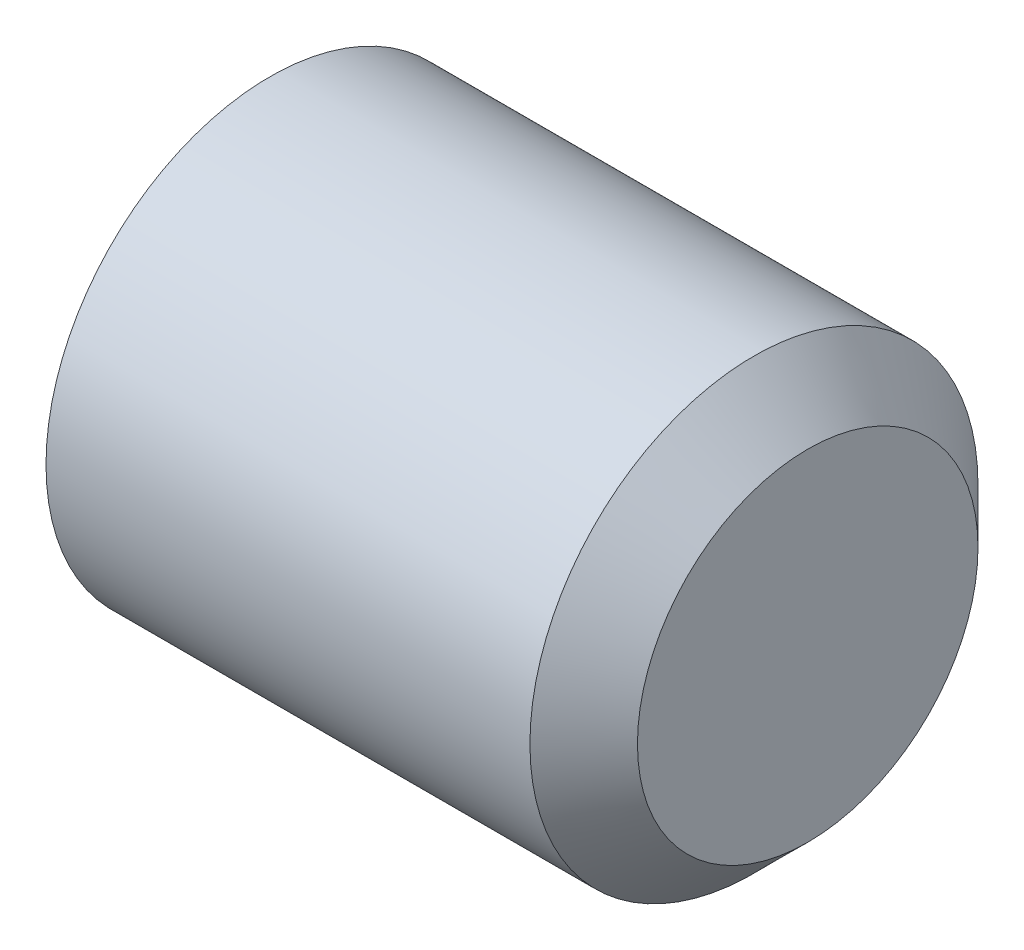
ISO-10303-21;
HEADER;
FILE_DESCRIPTION(('STEP AP214'),'2;1');
FILE_NAME('part.step','',(''),(''),'','','');
FILE_SCHEMA(('AUTOMOTIVE_DESIGN { 1 0 10303 214 1 1 1 1 }'));
ENDSEC;
DATA;
#1=APPLICATION_CONTEXT('core data for automotive mechanical design processes');
#2=APPLICATION_PROTOCOL_DEFINITION('international standard','automotive_design',2000,#1);
#3=PRODUCT_CONTEXT('',#1,'mechanical');
#4=PRODUCT('Part','Part','',(#3));
#5=PRODUCT_RELATED_PRODUCT_CATEGORY('part','',(#4));
#6=PRODUCT_DEFINITION_FORMATION('','',#4);
#7=PRODUCT_DEFINITION_CONTEXT('part definition',#1,'design');
#8=PRODUCT_DEFINITION('design','',#6,#7);
#9=PRODUCT_DEFINITION_SHAPE('','',#8);
#10=(LENGTH_UNIT() NAMED_UNIT(*) SI_UNIT(.MILLI.,.METRE.));
#11=(NAMED_UNIT(*) PLANE_ANGLE_UNIT() SI_UNIT($,.RADIAN.));
#12=(NAMED_UNIT(*) SI_UNIT($,.STERADIAN.) SOLID_ANGLE_UNIT());
#13=UNCERTAINTY_MEASURE_WITH_UNIT(LENGTH_MEASURE(1.E-05),#10,'distance_accuracy_value','');
#14=(GEOMETRIC_REPRESENTATION_CONTEXT(3) GLOBAL_UNCERTAINTY_ASSIGNED_CONTEXT((#13)) GLOBAL_UNIT_ASSIGNED_CONTEXT((#10,
#11,#12)) REPRESENTATION_CONTEXT('',''));
#15=CARTESIAN_POINT('',(0.,0.,0.));
#16=DIRECTION('',(0.,0.,1.));
#17=DIRECTION('',(1.,0.,0.));
#18=AXIS2_PLACEMENT_3D('',#15,#16,#17);
#19=CARTESIAN_POINT('',(-8.16005813953488,0.634999999999994,0.366617420935424));
#20=DIRECTION('',(-1.,0.,0.));
#21=DIRECTION('',(0.,0.,1.));
#22=AXIS2_PLACEMENT_3D('',#19,#20,#21);
#23=PLANE('',#22);
#24=DIRECTION('',(0.,0.,-1.));
#25=VECTOR('',#24,1.);
#26=CARTESIAN_POINT('',(-8.16005813953488,-0.635000000000006,-0.366617420935404));
#27=LINE('',#26,#25);
#28=CARTESIAN_POINT('',(-8.16005813953488,-0.635000000000006,-0.366617420935404));
#29=VERTEX_POINT('',#28);
#30=CARTESIAN_POINT('',(-8.16005813953488,-0.635000000000006,0.366617420935421));
#31=VERTEX_POINT('',#30);
#32=EDGE_CURVE('E90',#29,#31,#27,.F.);
#33=ORIENTED_EDGE('',*,*,#32,.T.);
#34=DIRECTION('',(0.,-0.866025403784437,-0.500000000000003));
#35=VECTOR('',#34,1.);
#36=CARTESIAN_POINT('',(-8.16005813953488,0.,0.733234841870835));
#37=LINE('',#36,#35);
#38=CARTESIAN_POINT('',(-8.16005813953488,0.,0.733234841870835));
#39=VERTEX_POINT('',#38);
#40=EDGE_CURVE('E97',#31,#39,#37,.F.);
#41=ORIENTED_EDGE('',*,*,#40,.T.);
#42=DIRECTION('',(0.,-0.86602540378444,0.499999999999998));
#43=VECTOR('',#42,1.);
#44=CARTESIAN_POINT('',(-8.16005813953488,0.634999999999994,0.366617420935425));
#45=LINE('',#44,#43);
#46=CARTESIAN_POINT('',(-8.16005813953488,0.634999999999994,0.366617420935425));
#47=VERTEX_POINT('',#46);
#48=EDGE_CURVE('E102',#39,#47,#45,.F.);
#49=ORIENTED_EDGE('',*,*,#48,.T.);
#50=DIRECTION('',(0.,0.,1.));
#51=VECTOR('',#50,1.);
#52=CARTESIAN_POINT('',(-8.16005813953488,0.634999999999993,-0.3666174209354));
#53=LINE('',#52,#51);
#54=CARTESIAN_POINT('',(-8.16005813953488,0.634999999999993,-0.3666174209354));
#55=VERTEX_POINT('',#54);
#56=EDGE_CURVE('E73',#47,#55,#53,.F.);
#57=ORIENTED_EDGE('',*,*,#56,.T.);
#58=DIRECTION('',(0.,0.866025403784437,0.500000000000003));
#59=VECTOR('',#58,1.);
#60=CARTESIAN_POINT('',(-8.16005813953488,0.634999999999993,-0.3666174209354));
#61=LINE('',#60,#59);
#62=CARTESIAN_POINT('',(-8.16005813953488,0.,-0.733234841870815));
#63=VERTEX_POINT('',#62);
#64=EDGE_CURVE('E70',#55,#63,#61,.F.);
#65=ORIENTED_EDGE('',*,*,#64,.T.);
#66=DIRECTION('',(0.,0.86602540378444,-0.499999999999998));
#67=VECTOR('',#66,1.);
#68=CARTESIAN_POINT('',(-8.16005813953488,0.,-0.733234841870815));
#69=LINE('',#68,#67);
#70=EDGE_CURVE('E67',#63,#29,#69,.F.);
#71=ORIENTED_EDGE('',*,*,#70,.T.);
#72=EDGE_LOOP('',(#33,#41,#49,#57,#65,#71));
#73=FACE_BOUND('',#72,.T.);
#74=ADVANCED_FACE('F17',(#73),#23,.T.);
#75=CARTESIAN_POINT('',(-6.41005813953488,0.,0.));
#76=DIRECTION('',(-1.,0.,0.));
#77=DIRECTION('',(0.,0.,1.));
#78=AXIS2_PLACEMENT_3D('',#75,#76,#77);
#79=PLANE('',#78);
#80=CARTESIAN_POINT('',(-6.41005813957918,0.,0.));
#81=DIRECTION('',(-1.,0.,0.));
#82=DIRECTION('',(0.,0.,1.));
#83=AXIS2_PLACEMENT_3D('',#80,#81,#82);
#84=CIRCLE('',#83,0.949999999988904);
#85=CARTESIAN_POINT('',(-6.41005813957918,0.,0.949999999988904));
#86=VERTEX_POINT('',#85);
#87=EDGE_CURVE('E20',#86,#86,#84,.T.);
#88=ORIENTED_EDGE('',*,*,#87,.F.);
#89=EDGE_LOOP('',(#88));
#90=FACE_BOUND('',#89,.T.);
#91=ADVANCED_FACE('F166',(#90),#79,.F.);
#92=CARTESIAN_POINT('',(-8.16005813953488,0.634999999999993,-0.3666174209354));
#93=DIRECTION('',(0.,0.500000000000003,-0.866025403784437));
#94=DIRECTION('',(0.,0.866025403784437,0.500000000000003));
#95=AXIS2_PLACEMENT_3D('',#92,#93,#94);
#96=PLANE('',#95);
#97=DIRECTION('',(1.,0.,0.));
#98=VECTOR('',#97,1.);
#99=CARTESIAN_POINT('',(-8.16005813953488,0.,-0.733234841870815));
#100=LINE('',#99,#98);
#101=CARTESIAN_POINT('',(-9.41005813953488,0.,-0.733234841870815));
#102=VERTEX_POINT('',#101);
#103=EDGE_CURVE('E76',#102,#63,#100,.T.);
#104=ORIENTED_EDGE('',*,*,#103,.T.);
#105=ORIENTED_EDGE('',*,*,#64,.F.);
#106=DIRECTION('',(1.,0.,0.));
#107=VECTOR('',#106,1.);
#108=CARTESIAN_POINT('',(-8.16005813953488,0.634999999999993,-0.3666174209354));
#109=LINE('',#108,#107);
#110=CARTESIAN_POINT('',(-9.41005813953488,0.634999999999993,-0.3666174209354));
#111=VERTEX_POINT('',#110);
#112=EDGE_CURVE('E107',#55,#111,#109,.F.);
#113=ORIENTED_EDGE('',*,*,#112,.T.);
#114=DIRECTION('',(0.,-0.866025403784437,-0.500000000000003));
#115=VECTOR('',#114,1.);
#116=CARTESIAN_POINT('',(-9.41005813953488,0.634999999999993,-0.3666174209354));
#117=LINE('',#116,#115);
#118=EDGE_CURVE('E81',#111,#102,#117,.T.);
#119=ORIENTED_EDGE('',*,*,#118,.T.);
#120=EDGE_LOOP('',(#104,#105,#113,#119));
#121=FACE_BOUND('',#120,.T.);
#122=ADVANCED_FACE('F79',(#121),#96,.F.);
#123=CARTESIAN_POINT('',(-8.16005813953488,0.,-0.733234841870815));
#124=DIRECTION('',(0.,-0.499999999999998,-0.86602540378444));
#125=DIRECTION('',(0.,0.86602540378444,-0.499999999999998));
#126=AXIS2_PLACEMENT_3D('',#123,#124,#125);
#127=PLANE('',#126);
#128=DIRECTION('',(1.,0.,0.));
#129=VECTOR('',#128,1.);
#130=CARTESIAN_POINT('',(-8.16005813953488,-0.635000000000006,-0.366617420935404));
#131=LINE('',#130,#129);
#132=CARTESIAN_POINT('',(-9.41005813953488,-0.635000000000006,-0.366617420935404));
#133=VERTEX_POINT('',#132);
#134=EDGE_CURVE('E87',#133,#29,#131,.T.);
#135=ORIENTED_EDGE('',*,*,#134,.T.);
#136=ORIENTED_EDGE('',*,*,#70,.F.);
#137=ORIENTED_EDGE('',*,*,#103,.F.);
#138=DIRECTION('',(0.,-0.86602540378444,0.499999999999998));
#139=VECTOR('',#138,1.);
#140=CARTESIAN_POINT('',(-9.41005813953488,0.,-0.733234841870815));
#141=LINE('',#140,#139);
#142=EDGE_CURVE('E113',#102,#133,#141,.T.);
#143=ORIENTED_EDGE('',*,*,#142,.T.);
#144=EDGE_LOOP('',(#135,#136,#137,#143));
#145=FACE_BOUND('',#144,.T.);
#146=ADVANCED_FACE('F85',(#145),#127,.F.);
#147=CARTESIAN_POINT('',(-8.16005813953488,-0.635000000000006,-0.366617420935404));
#148=DIRECTION('',(0.,-1.,0.));
#149=DIRECTION('',(0.,0.,-1.));
#150=AXIS2_PLACEMENT_3D('',#147,#148,#149);
#151=PLANE('',#150);
#152=DIRECTION('',(1.,0.,0.));
#153=VECTOR('',#152,1.);
#154=CARTESIAN_POINT('',(-8.16005813953488,-0.635000000000006,0.366617420935421));
#155=LINE('',#154,#153);
#156=CARTESIAN_POINT('',(-9.41005813953488,-0.635000000000006,0.366617420935421));
#157=VERTEX_POINT('',#156);
#158=EDGE_CURVE('E94',#157,#31,#155,.T.);
#159=ORIENTED_EDGE('',*,*,#158,.T.);
#160=ORIENTED_EDGE('',*,*,#32,.F.);
#161=ORIENTED_EDGE('',*,*,#134,.F.);
#162=DIRECTION('',(0.,0.,-1.));
#163=VECTOR('',#162,1.);
#164=CARTESIAN_POINT('',(-9.41005813953488,-0.635000000000006,0.));
#165=LINE('',#164,#163);
#166=EDGE_CURVE('E115',#133,#157,#165,.F.);
#167=ORIENTED_EDGE('',*,*,#166,.T.);
#168=EDGE_LOOP('',(#159,#160,#161,#167));
#169=FACE_BOUND('',#168,.T.);
#170=ADVANCED_FACE('F129',(#169),#151,.F.);
#171=CARTESIAN_POINT('',(-8.16005813953488,0.,0.733234841870835));
#172=DIRECTION('',(0.,-0.500000000000003,0.866025403784437));
#173=DIRECTION('',(0.,-0.866025403784437,-0.500000000000003));
#174=AXIS2_PLACEMENT_3D('',#171,#172,#173);
#175=PLANE('',#174);
#176=DIRECTION('',(1.,0.,0.));
#177=VECTOR('',#176,1.);
#178=CARTESIAN_POINT('',(-8.16005813953488,0.,0.733234841870835));
#179=LINE('',#178,#177);
#180=CARTESIAN_POINT('',(-9.41005813953488,0.,0.733234841870835));
#181=VERTEX_POINT('',#180);
#182=EDGE_CURVE('E99',#181,#39,#179,.T.);
#183=ORIENTED_EDGE('',*,*,#182,.T.);
#184=ORIENTED_EDGE('',*,*,#40,.F.);
#185=ORIENTED_EDGE('',*,*,#158,.F.);
#186=DIRECTION('',(0.,0.866025403784437,0.500000000000003));
#187=VECTOR('',#186,1.);
#188=CARTESIAN_POINT('',(-9.41005813953488,-0.635000000000006,0.366617420935421));
#189=LINE('',#188,#187);
#190=EDGE_CURVE('E117',#157,#181,#189,.T.);
#191=ORIENTED_EDGE('',*,*,#190,.T.);
#192=EDGE_LOOP('',(#183,#184,#185,#191));
#193=FACE_BOUND('',#192,.T.);
#194=ADVANCED_FACE('F134',(#193),#175,.F.);
#195=CARTESIAN_POINT('',(-8.16005813953488,0.634999999999994,0.366617420935425));
#196=DIRECTION('',(0.,0.499999999999998,0.86602540378444));
#197=DIRECTION('',(0.,-0.86602540378444,0.499999999999998));
#198=AXIS2_PLACEMENT_3D('',#195,#196,#197);
#199=PLANE('',#198);
#200=DIRECTION('',(1.,0.,0.));
#201=VECTOR('',#200,1.);
#202=CARTESIAN_POINT('',(-8.16005813953488,0.634999999999994,0.366617420935425));
#203=LINE('',#202,#201);
#204=CARTESIAN_POINT('',(-9.41005813953488,0.634999999999994,0.366617420935425));
#205=VERTEX_POINT('',#204);
#206=EDGE_CURVE('E104',#205,#47,#203,.T.);
#207=ORIENTED_EDGE('',*,*,#206,.T.);
#208=ORIENTED_EDGE('',*,*,#48,.F.);
#209=ORIENTED_EDGE('',*,*,#182,.F.);
#210=DIRECTION('',(0.,0.86602540378444,-0.499999999999998));
#211=VECTOR('',#210,1.);
#212=CARTESIAN_POINT('',(-9.41005813953488,0.,0.733234841870835));
#213=LINE('',#212,#211);
#214=EDGE_CURVE('E34',#181,#205,#213,.T.);
#215=ORIENTED_EDGE('',*,*,#214,.T.);
#216=EDGE_LOOP('',(#207,#208,#209,#215));
#217=FACE_BOUND('',#216,.T.);
#218=ADVANCED_FACE('F135',(#217),#199,.F.);
#219=CARTESIAN_POINT('',(-8.16005813953488,0.634999999999993,-0.3666174209354));
#220=DIRECTION('',(0.,1.,0.));
#221=DIRECTION('',(0.,0.,1.));
#222=AXIS2_PLACEMENT_3D('',#219,#220,#221);
#223=PLANE('',#222);
#224=ORIENTED_EDGE('',*,*,#112,.F.);
#225=ORIENTED_EDGE('',*,*,#56,.F.);
#226=ORIENTED_EDGE('',*,*,#206,.F.);
#227=DIRECTION('',(0.,0.,-1.));
#228=VECTOR('',#227,1.);
#229=CARTESIAN_POINT('',(-9.41005813953488,0.634999999999994,0.));
#230=LINE('',#229,#228);
#231=EDGE_CURVE('E111',#205,#111,#230,.T.);
#232=ORIENTED_EDGE('',*,*,#231,.T.);
#233=EDGE_LOOP('',(#224,#225,#226,#232));
#234=FACE_BOUND('',#233,.T.);
#235=ADVANCED_FACE('F123',(#234),#223,.F.);
#236=CARTESIAN_POINT('',(-6.71005813950387,0.,0.));
#237=DIRECTION('',(-1.,0.,0.));
#238=DIRECTION('',(0.,0.,1.));
#239=AXIS2_PLACEMENT_3D('',#236,#237,#238);
#240=CONICAL_SURFACE('',#239,1.24999999997044,0.785398163492187);
#241=CARTESIAN_POINT('',(-6.71005813953488,0.,0.));
#242=DIRECTION('',(-1.,0.,0.));
#243=DIRECTION('',(0.,0.,1.));
#244=AXIS2_PLACEMENT_3D('',#241,#242,#243);
#245=CIRCLE('',#244,1.25);
#246=CARTESIAN_POINT('',(-6.71005813953488,0.,1.25));
#247=VERTEX_POINT('',#246);
#248=EDGE_CURVE('E26',#247,#247,#245,.T.);
#249=ORIENTED_EDGE('',*,*,#248,.F.);
#250=EDGE_LOOP('',(#249));
#251=FACE_BOUND('',#250,.T.);
#252=ORIENTED_EDGE('',*,*,#87,.T.);
#253=EDGE_LOOP('',(#252));
#254=FACE_BOUND('',#253,.T.);
#255=ADVANCED_FACE('F143',(#251,#254),#240,.T.);
#256=CARTESIAN_POINT('',(-9.41005813953488,1.25,0.));
#257=DIRECTION('',(1.,0.,0.));
#258=DIRECTION('',(0.,0.,-1.));
#259=AXIS2_PLACEMENT_3D('',#256,#257,#258);
#260=PLANE('',#259);
#261=CARTESIAN_POINT('',(-9.41005813953488,0.,0.));
#262=DIRECTION('',(-1.,0.,0.));
#263=DIRECTION('',(0.,0.,1.));
#264=AXIS2_PLACEMENT_3D('',#261,#262,#263);
#265=CIRCLE('',#264,1.25);
#266=CARTESIAN_POINT('',(-9.41005813953488,0.,1.25));
#267=VERTEX_POINT('',#266);
#268=EDGE_CURVE('E11',#267,#267,#265,.F.);
#269=ORIENTED_EDGE('',*,*,#268,.F.);
#270=EDGE_LOOP('',(#269));
#271=FACE_BOUND('',#270,.T.);
#272=ORIENTED_EDGE('',*,*,#214,.F.);
#273=ORIENTED_EDGE('',*,*,#190,.F.);
#274=ORIENTED_EDGE('',*,*,#166,.F.);
#275=ORIENTED_EDGE('',*,*,#142,.F.);
#276=ORIENTED_EDGE('',*,*,#118,.F.);
#277=ORIENTED_EDGE('',*,*,#231,.F.);
#278=EDGE_LOOP('',(#272,#273,#274,#275,#276,#277));
#279=FACE_BOUND('',#278,.T.);
#280=ADVANCED_FACE('F125',(#271,#279),#260,.F.);
#281=CARTESIAN_POINT('',(-21.9665697674419,0.,0.));
#282=DIRECTION('',(-1.,0.,0.));
#283=DIRECTION('',(0.,0.,1.));
#284=AXIS2_PLACEMENT_3D('',#281,#282,#283);
#285=CYLINDRICAL_SURFACE('',#284,1.25);
#286=ORIENTED_EDGE('',*,*,#268,.T.);
#287=EDGE_LOOP('',(#286));
#288=FACE_BOUND('',#287,.T.);
#289=ORIENTED_EDGE('',*,*,#248,.T.);
#290=EDGE_LOOP('',(#289));
#291=FACE_BOUND('',#290,.T.);
#292=ADVANCED_FACE('F146',(#288,#291),#285,.T.);
#293=CLOSED_SHELL('',(#74,#91,#122,#146,#170,#194,#218,#235,#255,#280,#292));
#294=MANIFOLD_SOLID_BREP('B1',#293);
#295=ADVANCED_BREP_SHAPE_REPRESENTATION('',(#18,#294),#14);
#296=SHAPE_DEFINITION_REPRESENTATION(#9,#295);
ENDSEC;
END-ISO-10303-21;
